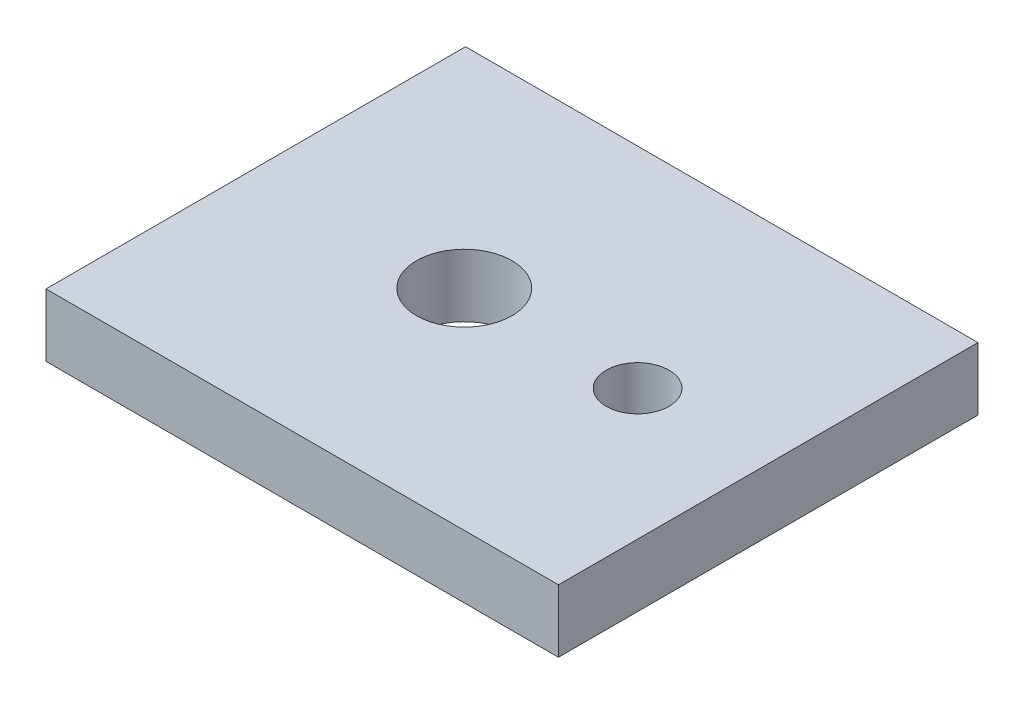
ISO-10303-21;
HEADER;
FILE_DESCRIPTION(('STEP AP214'),'2;1');
FILE_NAME('part.step','',(''),(''),'','','');
FILE_SCHEMA(('AUTOMOTIVE_DESIGN { 1 0 10303 214 1 1 1 1 }'));
ENDSEC;
DATA;
#1=APPLICATION_CONTEXT('core data for automotive mechanical design processes');
#2=APPLICATION_PROTOCOL_DEFINITION('international standard','automotive_design',2000,#1);
#3=PRODUCT_CONTEXT('',#1,'mechanical');
#4=PRODUCT('Part','Part','',(#3));
#5=PRODUCT_RELATED_PRODUCT_CATEGORY('part','',(#4));
#6=PRODUCT_DEFINITION_FORMATION('','',#4);
#7=PRODUCT_DEFINITION_CONTEXT('part definition',#1,'design');
#8=PRODUCT_DEFINITION('design','',#6,#7);
#9=PRODUCT_DEFINITION_SHAPE('','',#8);
#10=(LENGTH_UNIT() NAMED_UNIT(*) SI_UNIT(.MILLI.,.METRE.));
#11=(NAMED_UNIT(*) PLANE_ANGLE_UNIT() SI_UNIT($,.RADIAN.));
#12=(NAMED_UNIT(*) SI_UNIT($,.STERADIAN.) SOLID_ANGLE_UNIT());
#13=UNCERTAINTY_MEASURE_WITH_UNIT(LENGTH_MEASURE(1.E-05),#10,'distance_accuracy_value','');
#14=(GEOMETRIC_REPRESENTATION_CONTEXT(3) GLOBAL_UNCERTAINTY_ASSIGNED_CONTEXT((#13)) GLOBAL_UNIT_ASSIGNED_CONTEXT((#10,
#11,#12)) REPRESENTATION_CONTEXT('',''));
#15=CARTESIAN_POINT('',(0.,0.,0.));
#16=DIRECTION('',(0.,0.,1.));
#17=DIRECTION('',(1.,0.,0.));
#18=AXIS2_PLACEMENT_3D('',#15,#16,#17);
#19=CARTESIAN_POINT('',(0.,6.35,0.));
#20=DIRECTION('',(0.,1.,0.));
#21=DIRECTION('',(0.,0.,1.));
#22=AXIS2_PLACEMENT_3D('',#19,#20,#21);
#23=PLANE('',#22);
#24=CARTESIAN_POINT('',(-30.734,6.35,-21.209));
#25=DIRECTION('',(0.,1.,0.));
#26=DIRECTION('',(0.,0.,1.));
#27=AXIS2_PLACEMENT_3D('',#24,#25,#26);
#28=CIRCLE('',#27,4.826);
#29=CARTESIAN_POINT('',(-30.734,6.35,-16.383));
#30=VERTEX_POINT('',#29);
#31=EDGE_CURVE('E110',#30,#30,#28,.T.);
#32=ORIENTED_EDGE('',*,*,#31,.F.);
#33=EDGE_LOOP('',(#32));
#34=FACE_BOUND('',#33,.T.);
#35=DIRECTION('',(0.,0.,-1.));
#36=VECTOR('',#35,1.);
#37=CARTESIAN_POINT('',(0.,6.35,0.));
#38=LINE('',#37,#36);
#39=CARTESIAN_POINT('',(0.,6.35,0.));
#40=VERTEX_POINT('',#39);
#41=CARTESIAN_POINT('',(0.,6.35,-42.418));
#42=VERTEX_POINT('',#41);
#43=EDGE_CURVE('E95',#40,#42,#38,.T.);
#44=ORIENTED_EDGE('',*,*,#43,.T.);
#45=DIRECTION('',(-1.,0.,0.));
#46=VECTOR('',#45,1.);
#47=CARTESIAN_POINT('',(0.,6.35,-42.418));
#48=LINE('',#47,#46);
#49=CARTESIAN_POINT('',(-51.816,6.35,-42.418));
#50=VERTEX_POINT('',#49);
#51=EDGE_CURVE('E90',#42,#50,#48,.T.);
#52=ORIENTED_EDGE('',*,*,#51,.T.);
#53=DIRECTION('',(0.,0.,1.));
#54=VECTOR('',#53,1.);
#55=CARTESIAN_POINT('',(-51.816,6.35,0.));
#56=LINE('',#55,#54);
#57=CARTESIAN_POINT('',(-51.816,6.35,0.));
#58=VERTEX_POINT('',#57);
#59=EDGE_CURVE('E93',#50,#58,#56,.T.);
#60=ORIENTED_EDGE('',*,*,#59,.T.);
#61=DIRECTION('',(1.,0.,0.));
#62=VECTOR('',#61,1.);
#63=CARTESIAN_POINT('',(0.,6.35,0.));
#64=LINE('',#63,#62);
#65=EDGE_CURVE('E60',#58,#40,#64,.T.);
#66=ORIENTED_EDGE('',*,*,#65,.T.);
#67=EDGE_LOOP('',(#44,#52,#60,#66));
#68=FACE_BOUND('',#67,.T.);
#69=CARTESIAN_POINT('',(-13.208,6.35,-21.209));
#70=DIRECTION('',(0.,1.,0.));
#71=DIRECTION('',(0.,0.,1.));
#72=AXIS2_PLACEMENT_3D('',#69,#70,#71);
#73=CIRCLE('',#72,3.175);
#74=CARTESIAN_POINT('',(-13.208,6.35,-18.034));
#75=VERTEX_POINT('',#74);
#76=EDGE_CURVE('E125',#75,#75,#73,.T.);
#77=ORIENTED_EDGE('',*,*,#76,.F.);
#78=EDGE_LOOP('',(#77));
#79=FACE_BOUND('',#78,.T.);
#80=ADVANCED_FACE('F43',(#34,#68,#79),#23,.T.);
#81=CARTESIAN_POINT('',(0.,0.,0.));
#82=DIRECTION('',(0.,1.,0.));
#83=DIRECTION('',(0.,0.,1.));
#84=AXIS2_PLACEMENT_3D('',#81,#82,#83);
#85=PLANE('',#84);
#86=DIRECTION('',(0.,0.,-1.));
#87=VECTOR('',#86,1.);
#88=CARTESIAN_POINT('',(0.,0.,0.));
#89=LINE('',#88,#87);
#90=CARTESIAN_POINT('',(0.,0.,0.));
#91=VERTEX_POINT('',#90);
#92=CARTESIAN_POINT('',(0.,0.,-42.418));
#93=VERTEX_POINT('',#92);
#94=EDGE_CURVE('E107',#91,#93,#89,.T.);
#95=ORIENTED_EDGE('',*,*,#94,.F.);
#96=DIRECTION('',(1.,0.,0.));
#97=VECTOR('',#96,1.);
#98=CARTESIAN_POINT('',(0.,0.,0.));
#99=LINE('',#98,#97);
#100=CARTESIAN_POINT('',(-51.816,0.,0.));
#101=VERTEX_POINT('',#100);
#102=EDGE_CURVE('E83',#101,#91,#99,.T.);
#103=ORIENTED_EDGE('',*,*,#102,.F.);
#104=DIRECTION('',(0.,0.,1.));
#105=VECTOR('',#104,1.);
#106=CARTESIAN_POINT('',(-51.816,0.,0.));
#107=LINE('',#106,#105);
#108=CARTESIAN_POINT('',(-51.816,0.,-42.418));
#109=VERTEX_POINT('',#108);
#110=EDGE_CURVE('E77',#109,#101,#107,.T.);
#111=ORIENTED_EDGE('',*,*,#110,.F.);
#112=DIRECTION('',(-1.,0.,0.));
#113=VECTOR('',#112,1.);
#114=CARTESIAN_POINT('',(0.,0.,-42.418));
#115=LINE('',#114,#113);
#116=EDGE_CURVE('E99',#93,#109,#115,.T.);
#117=ORIENTED_EDGE('',*,*,#116,.F.);
#118=EDGE_LOOP('',(#95,#103,#111,#117));
#119=FACE_BOUND('',#118,.T.);
#120=CARTESIAN_POINT('',(-30.734,0.,-21.209));
#121=DIRECTION('',(0.,1.,0.));
#122=DIRECTION('',(0.,0.,1.));
#123=AXIS2_PLACEMENT_3D('',#120,#121,#122);
#124=CIRCLE('',#123,4.826);
#125=CARTESIAN_POINT('',(-30.734,0.,-16.383));
#126=VERTEX_POINT('',#125);
#127=EDGE_CURVE('E122',#126,#126,#124,.T.);
#128=ORIENTED_EDGE('',*,*,#127,.T.);
#129=EDGE_LOOP('',(#128));
#130=FACE_BOUND('',#129,.T.);
#131=CARTESIAN_POINT('',(-13.208,0.,-21.209));
#132=DIRECTION('',(0.,1.,0.));
#133=DIRECTION('',(0.,0.,1.));
#134=AXIS2_PLACEMENT_3D('',#131,#132,#133);
#135=CIRCLE('',#134,3.175);
#136=CARTESIAN_POINT('',(-13.208,0.,-18.034));
#137=VERTEX_POINT('',#136);
#138=EDGE_CURVE('E128',#137,#137,#135,.T.);
#139=ORIENTED_EDGE('',*,*,#138,.T.);
#140=EDGE_LOOP('',(#139));
#141=FACE_BOUND('',#140,.T.);
#142=ADVANCED_FACE('F118',(#119,#130,#141),#85,.F.);
#143=CARTESIAN_POINT('',(0.,6.35,0.));
#144=DIRECTION('',(-1.,0.,0.));
#145=DIRECTION('',(0.,0.,1.));
#146=AXIS2_PLACEMENT_3D('',#143,#144,#145);
#147=PLANE('',#146);
#148=ORIENTED_EDGE('',*,*,#94,.T.);
#149=DIRECTION('',(0.,-1.,0.));
#150=VECTOR('',#149,1.);
#151=CARTESIAN_POINT('',(0.,6.35,-42.418));
#152=LINE('',#151,#150);
#153=EDGE_CURVE('E11',#42,#93,#152,.T.);
#154=ORIENTED_EDGE('',*,*,#153,.F.);
#155=ORIENTED_EDGE('',*,*,#43,.F.);
#156=DIRECTION('',(0.,-1.,0.));
#157=VECTOR('',#156,1.);
#158=CARTESIAN_POINT('',(0.,6.35,0.));
#159=LINE('',#158,#157);
#160=EDGE_CURVE('E103',#40,#91,#159,.T.);
#161=ORIENTED_EDGE('',*,*,#160,.T.);
#162=EDGE_LOOP('',(#148,#154,#155,#161));
#163=FACE_BOUND('',#162,.T.);
#164=ADVANCED_FACE('F45',(#163),#147,.F.);
#165=CARTESIAN_POINT('',(0.,6.35,-42.418));
#166=DIRECTION('',(0.,0.,1.));
#167=DIRECTION('',(1.,0.,0.));
#168=AXIS2_PLACEMENT_3D('',#165,#166,#167);
#169=PLANE('',#168);
#170=ORIENTED_EDGE('',*,*,#116,.T.);
#171=DIRECTION('',(0.,-1.,0.));
#172=VECTOR('',#171,1.);
#173=CARTESIAN_POINT('',(-51.816,6.35,-42.418));
#174=LINE('',#173,#172);
#175=EDGE_CURVE('E52',#50,#109,#174,.T.);
#176=ORIENTED_EDGE('',*,*,#175,.F.);
#177=ORIENTED_EDGE('',*,*,#51,.F.);
#178=ORIENTED_EDGE('',*,*,#153,.T.);
#179=EDGE_LOOP('',(#170,#176,#177,#178));
#180=FACE_BOUND('',#179,.T.);
#181=ADVANCED_FACE('F98',(#180),#169,.F.);
#182=CARTESIAN_POINT('',(-51.816,6.35,0.));
#183=DIRECTION('',(1.,0.,0.));
#184=DIRECTION('',(0.,0.,-1.));
#185=AXIS2_PLACEMENT_3D('',#182,#183,#184);
#186=PLANE('',#185);
#187=ORIENTED_EDGE('',*,*,#110,.T.);
#188=DIRECTION('',(0.,-1.,0.));
#189=VECTOR('',#188,1.);
#190=CARTESIAN_POINT('',(-51.816,6.35,0.));
#191=LINE('',#190,#189);
#192=EDGE_CURVE('E100',#58,#101,#191,.T.);
#193=ORIENTED_EDGE('',*,*,#192,.F.);
#194=ORIENTED_EDGE('',*,*,#59,.F.);
#195=ORIENTED_EDGE('',*,*,#175,.T.);
#196=EDGE_LOOP('',(#187,#193,#194,#195));
#197=FACE_BOUND('',#196,.T.);
#198=ADVANCED_FACE('F101',(#197),#186,.F.);
#199=CARTESIAN_POINT('',(0.,6.35,0.));
#200=DIRECTION('',(0.,0.,-1.));
#201=DIRECTION('',(-1.,0.,0.));
#202=AXIS2_PLACEMENT_3D('',#199,#200,#201);
#203=PLANE('',#202);
#204=ORIENTED_EDGE('',*,*,#102,.T.);
#205=ORIENTED_EDGE('',*,*,#160,.F.);
#206=ORIENTED_EDGE('',*,*,#65,.F.);
#207=ORIENTED_EDGE('',*,*,#192,.T.);
#208=EDGE_LOOP('',(#204,#205,#206,#207));
#209=FACE_BOUND('',#208,.T.);
#210=ADVANCED_FACE('F115',(#209),#203,.F.);
#211=CARTESIAN_POINT('',(-30.734,6.35,-21.209));
#212=DIRECTION('',(0.,-1.,0.));
#213=DIRECTION('',(0.,0.,-1.));
#214=AXIS2_PLACEMENT_3D('',#211,#212,#213);
#215=CYLINDRICAL_SURFACE('',#214,4.826);
#216=ORIENTED_EDGE('',*,*,#31,.T.);
#217=EDGE_LOOP('',(#216));
#218=FACE_BOUND('',#217,.T.);
#219=ORIENTED_EDGE('',*,*,#127,.F.);
#220=EDGE_LOOP('',(#219));
#221=FACE_BOUND('',#220,.T.);
#222=ADVANCED_FACE('F145',(#218,#221),#215,.F.);
#223=CARTESIAN_POINT('',(-13.208,6.35,-21.209));
#224=DIRECTION('',(0.,-1.,0.));
#225=DIRECTION('',(0.,0.,-1.));
#226=AXIS2_PLACEMENT_3D('',#223,#224,#225);
#227=CYLINDRICAL_SURFACE('',#226,3.175);
#228=ORIENTED_EDGE('',*,*,#76,.T.);
#229=EDGE_LOOP('',(#228));
#230=FACE_BOUND('',#229,.T.);
#231=ORIENTED_EDGE('',*,*,#138,.F.);
#232=EDGE_LOOP('',(#231));
#233=FACE_BOUND('',#232,.T.);
#234=ADVANCED_FACE('F134',(#230,#233),#227,.F.);
#235=CLOSED_SHELL('',(#80,#142,#164,#181,#198,#210,#222,#234));
#236=MANIFOLD_SOLID_BREP('B2',#235);
#237=ADVANCED_BREP_SHAPE_REPRESENTATION('',(#18,#236),#14);
#238=SHAPE_DEFINITION_REPRESENTATION(#9,#237);
ENDSEC;
END-ISO-10303-21;
